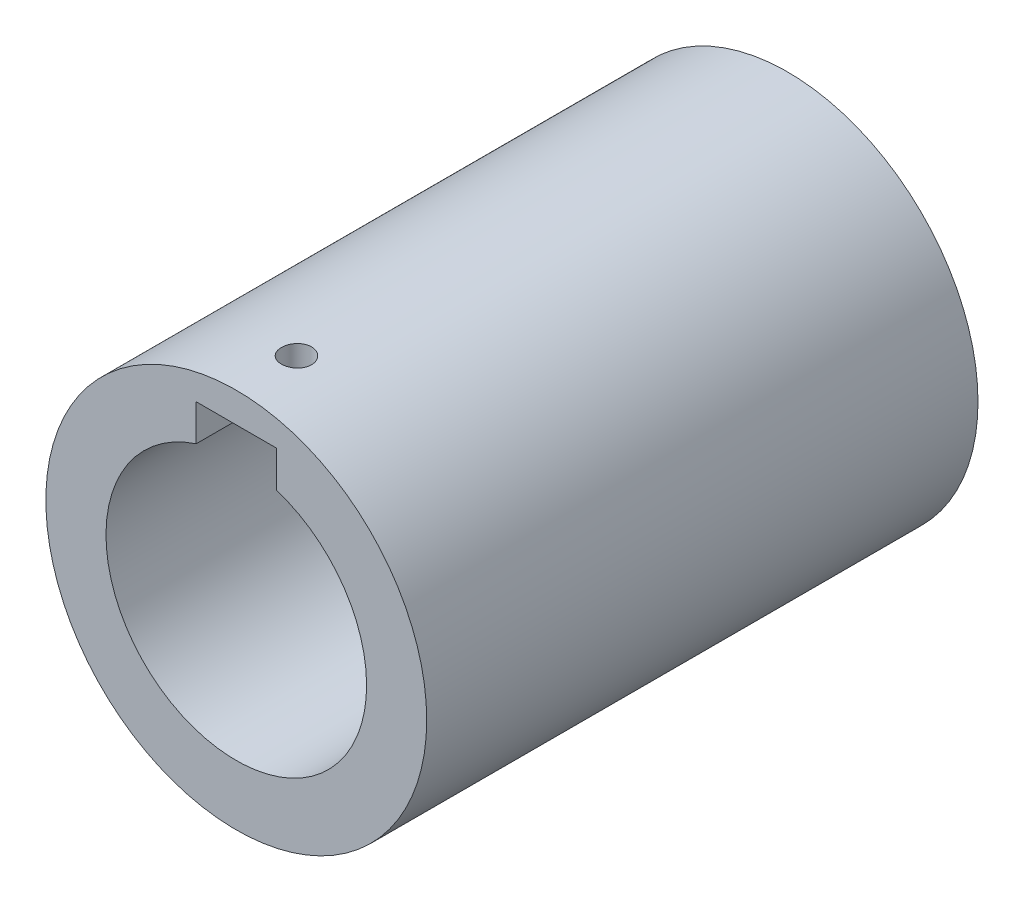
ISO-10303-21;
HEADER;
FILE_DESCRIPTION(('STEP AP214'),'2;1');
FILE_NAME('part.step','',(''),(''),'','','');
FILE_SCHEMA(('AUTOMOTIVE_DESIGN { 1 0 10303 214 1 1 1 1 }'));
ENDSEC;
DATA;
#1=APPLICATION_CONTEXT('core data for automotive mechanical design processes');
#2=APPLICATION_PROTOCOL_DEFINITION('international standard','automotive_design',2000,#1);
#3=PRODUCT_CONTEXT('',#1,'mechanical');
#4=PRODUCT('Part','Part','',(#3));
#5=PRODUCT_RELATED_PRODUCT_CATEGORY('part','',(#4));
#6=PRODUCT_DEFINITION_FORMATION('','',#4);
#7=PRODUCT_DEFINITION_CONTEXT('part definition',#1,'design');
#8=PRODUCT_DEFINITION('design','',#6,#7);
#9=PRODUCT_DEFINITION_SHAPE('','',#8);
#10=(LENGTH_UNIT() NAMED_UNIT(*) SI_UNIT(.MILLI.,.METRE.));
#11=(NAMED_UNIT(*) PLANE_ANGLE_UNIT() SI_UNIT($,.RADIAN.));
#12=(NAMED_UNIT(*) SI_UNIT($,.STERADIAN.) SOLID_ANGLE_UNIT());
#13=UNCERTAINTY_MEASURE_WITH_UNIT(LENGTH_MEASURE(1.E-05),#10,'distance_accuracy_value','');
#14=(GEOMETRIC_REPRESENTATION_CONTEXT(3) GLOBAL_UNCERTAINTY_ASSIGNED_CONTEXT((#13)) GLOBAL_UNIT_ASSIGNED_CONTEXT((#10,
#11,#12)) REPRESENTATION_CONTEXT('',''));
#15=CARTESIAN_POINT('',(0.,0.,0.));
#16=DIRECTION('',(0.,0.,1.));
#17=DIRECTION('',(1.,0.,0.));
#18=AXIS2_PLACEMENT_3D('',#15,#16,#17);
#19=CARTESIAN_POINT('',(0.,0.,55.));
#20=DIRECTION('',(0.,0.,1.));
#21=DIRECTION('',(1.,0.,0.));
#22=AXIS2_PLACEMENT_3D('',#19,#20,#21);
#23=PLANE('',#22);
#24=DIRECTION('',(0.,1.,0.));
#25=VECTOR('',#24,1.);
#26=CARTESIAN_POINT('',(4.,16.,55.));
#27=LINE('',#26,#25);
#28=CARTESIAN_POINT('',(4.,12.369316876853,55.));
#29=VERTEX_POINT('',#28);
#30=CARTESIAN_POINT('',(4.,16.,55.));
#31=VERTEX_POINT('',#30);
#32=EDGE_CURVE('E107',#29,#31,#27,.T.);
#33=ORIENTED_EDGE('',*,*,#32,.F.);
#34=CARTESIAN_POINT('',(0.,0.,55.));
#35=DIRECTION('',(0.,0.,1.));
#36=DIRECTION('',(1.,0.,0.));
#37=AXIS2_PLACEMENT_3D('',#34,#35,#36);
#38=CIRCLE('',#37,13.);
#39=CARTESIAN_POINT('',(-4.,12.369316876853,55.));
#40=VERTEX_POINT('',#39);
#41=EDGE_CURVE('E127',#40,#29,#38,.T.);
#42=ORIENTED_EDGE('',*,*,#41,.F.);
#43=DIRECTION('',(0.,-1.,0.));
#44=VECTOR('',#43,1.);
#45=CARTESIAN_POINT('',(-4.,16.,55.));
#46=LINE('',#45,#44);
#47=CARTESIAN_POINT('',(-4.,16.,55.));
#48=VERTEX_POINT('',#47);
#49=EDGE_CURVE('E104',#48,#40,#46,.T.);
#50=ORIENTED_EDGE('',*,*,#49,.F.);
#51=DIRECTION('',(-1.,0.,0.));
#52=VECTOR('',#51,1.);
#53=CARTESIAN_POINT('',(-4.,16.,55.));
#54=LINE('',#53,#52);
#55=EDGE_CURVE('E96',#31,#48,#54,.T.);
#56=ORIENTED_EDGE('',*,*,#55,.F.);
#57=EDGE_LOOP('',(#33,#42,#50,#56));
#58=FACE_BOUND('',#57,.T.);
#59=CARTESIAN_POINT('',(0.,0.,55.));
#60=DIRECTION('',(0.,0.,1.));
#61=DIRECTION('',(1.,0.,0.));
#62=AXIS2_PLACEMENT_3D('',#59,#60,#61);
#63=CIRCLE('',#62,19.);
#64=CARTESIAN_POINT('',(19.,0.,55.));
#65=VERTEX_POINT('',#64);
#66=EDGE_CURVE('E134',#65,#65,#63,.T.);
#67=ORIENTED_EDGE('',*,*,#66,.T.);
#68=EDGE_LOOP('',(#67));
#69=FACE_BOUND('',#68,.T.);
#70=ADVANCED_FACE('F39',(#58,#69),#23,.T.);
#71=CARTESIAN_POINT('',(0.,0.,0.));
#72=DIRECTION('',(0.,0.,1.));
#73=DIRECTION('',(1.,0.,0.));
#74=AXIS2_PLACEMENT_3D('',#71,#72,#73);
#75=PLANE('',#74);
#76=CARTESIAN_POINT('',(0.,0.,0.));
#77=DIRECTION('',(0.,0.,1.));
#78=DIRECTION('',(1.,0.,0.));
#79=AXIS2_PLACEMENT_3D('',#76,#77,#78);
#80=CIRCLE('',#79,19.);
#81=CARTESIAN_POINT('',(19.,0.,0.));
#82=VERTEX_POINT('',#81);
#83=EDGE_CURVE('E130',#82,#82,#80,.T.);
#84=ORIENTED_EDGE('',*,*,#83,.F.);
#85=EDGE_LOOP('',(#84));
#86=FACE_BOUND('',#85,.T.);
#87=CARTESIAN_POINT('',(0.,0.,0.));
#88=DIRECTION('',(0.,0.,1.));
#89=DIRECTION('',(1.,0.,0.));
#90=AXIS2_PLACEMENT_3D('',#87,#88,#89);
#91=CIRCLE('',#90,13.);
#92=CARTESIAN_POINT('',(13.,0.,0.));
#93=VERTEX_POINT('',#92);
#94=EDGE_CURVE('E125',#93,#93,#91,.T.);
#95=ORIENTED_EDGE('',*,*,#94,.T.);
#96=EDGE_LOOP('',(#95));
#97=FACE_BOUND('',#96,.T.);
#98=ADVANCED_FACE('F175',(#86,#97),#75,.F.);
#99=CARTESIAN_POINT('',(0.,0.,55.));
#100=DIRECTION('',(0.,0.,-1.));
#101=DIRECTION('',(-1.,0.,0.));
#102=AXIS2_PLACEMENT_3D('',#99,#100,#101);
#103=CYLINDRICAL_SURFACE('',#102,19.);
#104=CARTESIAN_POINT('',(0.,19.,47.5));
#105=CARTESIAN_POINT('',(0.084115138718851,18.999999221537,47.5000036806583));
#106=CARTESIAN_POINT('',(0.168287922827546,18.9994354600354,47.5070991504153));
#107=CARTESIAN_POINT('',(0.33430569859837,18.997240706404,47.5353005253483));
#108=CARTESIAN_POINT('',(0.416147925046003,18.9956084974586,47.5564224050853));
#109=CARTESIAN_POINT('',(0.575076027563787,18.9914613431667,47.6120629682147));
#110=CARTESIAN_POINT('',(0.652164524677554,18.9889468894701,47.6465741912389));
#111=CARTESIAN_POINT('',(0.799435680795714,18.9833174206842,47.7280007301823));
#112=CARTESIAN_POINT('',(0.869619836810095,18.9802025362166,47.7749133490418));
#113=CARTESIAN_POINT('',(1.00127051563137,18.9737138537755,47.8799279533634));
#114=CARTESIAN_POINT('',(1.06271896083147,18.9703395405387,47.9380525718033));
#115=CARTESIAN_POINT('',(1.1749989049417,18.9637166459802,48.0637935919702));
#116=CARTESIAN_POINT('',(1.22582994292754,18.960468070122,48.1314104055608));
#117=CARTESIAN_POINT('',(1.31549242293151,18.9544588143707,48.2743246715858));
#118=CARTESIAN_POINT('',(1.3543081273485,18.951698776369,48.3496320268814));
#119=CARTESIAN_POINT('',(1.41873755115466,18.9469848112354,48.5057205754701));
#120=CARTESIAN_POINT('',(1.4443514822562,18.9450308711765,48.5865016809588));
#121=CARTESIAN_POINT('',(1.48159822322927,18.9421545390237,48.7510646600902));
#122=CARTESIAN_POINT('',(1.49326029941244,18.9412299879009,48.8348398713211));
#123=CARTESIAN_POINT('',(1.50236268465663,18.9405102433779,49.003163408575));
#124=CARTESIAN_POINT('',(1.49980323578884,18.9407150307546,49.0877117214142));
#125=CARTESIAN_POINT('',(1.48055943130006,18.9422288673013,49.2549811550176));
#126=CARTESIAN_POINT('',(1.46390684932511,18.9435354324364,49.3377059568554));
#127=CARTESIAN_POINT('',(1.41699882958061,18.9471017023429,49.4991826075616));
#128=CARTESIAN_POINT('',(1.38674327091874,18.9493614155851,49.5779344211145));
#129=CARTESIAN_POINT('',(1.31345245016364,18.9545822190074,49.7293310748596));
#130=CARTESIAN_POINT('',(1.27040289564839,18.9575440928322,49.8019689679994));
#131=CARTESIAN_POINT('',(1.17275641592226,18.9638347400174,49.9389998939552));
#132=CARTESIAN_POINT('',(1.11815928117867,18.9671635200349,50.0033927771302));
#133=CARTESIAN_POINT('',(0.998789069552177,18.9738239428695,50.1222905794803));
#134=CARTESIAN_POINT('',(0.93398851719736,18.9771555685343,50.1767679187932));
#135=CARTESIAN_POINT('',(0.796146882184878,18.9834375709718,50.2740750993956));
#136=CARTESIAN_POINT('',(0.72310579473344,18.9863879475227,50.3169049339094));
#137=CARTESIAN_POINT('',(0.570838809989566,18.991575496542,50.3896994627351));
#138=CARTESIAN_POINT('',(0.491612346167742,18.9938126035852,50.4196629769609));
#139=CARTESIAN_POINT('',(0.329231606345084,18.9973207725944,50.4658552097145));
#140=CARTESIAN_POINT('',(0.246077403532168,18.9985918525535,50.4820841840598));
#141=CARTESIAN_POINT('',(0.0784407393713365,19.0000224384176,50.5003121722034));
#142=CARTESIAN_POINT('',(-0.00603755448042458,19.0001849207592,50.5023492895524));
#143=CARTESIAN_POINT('',(-0.174134501687005,18.9993879456588,50.492235494717));
#144=CARTESIAN_POINT('',(-0.257753162221247,18.9984284975946,50.4800847011234));
#145=CARTESIAN_POINT('',(-0.421648876867881,18.9954975020934,50.4419715748979));
#146=CARTESIAN_POINT('',(-0.501930053359414,18.9935272459175,50.4160268618352));
#147=CARTESIAN_POINT('',(-0.656999501829896,18.9887960412095,50.3510803435539));
#148=CARTESIAN_POINT('',(-0.731787695596674,18.9860350814215,50.3120783524625));
#149=CARTESIAN_POINT('',(-0.873921875208908,18.9800247197833,50.2220283552006));
#150=CARTESIAN_POINT('',(-0.94125179386462,18.976774297697,50.1709550578487));
#151=CARTESIAN_POINT('',(-1.06639608992059,18.9701537726923,50.0582488302556));
#152=CARTESIAN_POINT('',(-1.1242103188841,18.9667836679079,49.9966157353209));
#153=CARTESIAN_POINT('',(-1.22881242487571,18.9602948383227,49.8643743241758));
#154=CARTESIAN_POINT('',(-1.27557547077564,18.9571766897926,49.7937463345234));
#155=CARTESIAN_POINT('',(-1.35657761913601,18.9515527813904,49.6456181472087));
#156=CARTESIAN_POINT('',(-1.39081683559963,18.9490470159439,49.5681180121109));
#157=CARTESIAN_POINT('',(-1.44575693555035,18.94493468603,49.4085340498936));
#158=CARTESIAN_POINT('',(-1.46647311943613,18.9433271056248,49.3264555174995));
#159=CARTESIAN_POINT('',(-1.49382895011884,18.9411896745755,49.1599719251866));
#160=CARTESIAN_POINT('',(-1.50046883646069,18.9406598055914,49.0755669048838));
#161=CARTESIAN_POINT('',(-1.49948094344338,18.9407380213103,48.9070730705285));
#162=CARTESIAN_POINT('',(-1.49189218322356,18.9413429939456,48.8229840234992));
#163=CARTESIAN_POINT('',(-1.46274366938462,18.9436161189885,48.6572785634905));
#164=CARTESIAN_POINT('',(-1.44118389337775,18.9452842730997,48.5756621544735));
#165=CARTESIAN_POINT('',(-1.38471500507716,18.9494949902263,48.4172155015649));
#166=CARTESIAN_POINT('',(-1.34980648222261,18.9520375146316,48.3403850465146));
#167=CARTESIAN_POINT('',(-1.267635548191,18.9577105355609,48.1936691095256));
#168=CARTESIAN_POINT('',(-1.22037336027397,18.9608410214587,48.1237835021084));
#169=CARTESIAN_POINT('',(-1.11469031191135,18.967347409111,47.992741598558));
#170=CARTESIAN_POINT('',(-1.05624065477125,18.9707239299605,47.9316085574228));
#171=CARTESIAN_POINT('',(-0.929892124489476,18.977336317951,47.8199972193479));
#172=CARTESIAN_POINT('',(-0.861990962632755,18.9805721507741,47.7695215105922));
#173=CARTESIAN_POINT('',(-0.718548782250667,18.9865438065605,47.6805972871622));
#174=CARTESIAN_POINT('',(-0.642994879159652,18.989278763737,47.6421695178135));
#175=CARTESIAN_POINT('',(-0.486538032284915,18.9939300983643,47.5785939990502));
#176=CARTESIAN_POINT('',(-0.405641386546966,18.9958474204367,47.5534309168337));
#177=CARTESIAN_POINT('',(-0.270219385273124,18.9981528412889,47.5235385171398));
#178=CARTESIAN_POINT('',(-0.216566049108646,18.9988423900528,47.5147232304149));
#179=CARTESIAN_POINT('',(-0.108616487728126,18.9997662202352,47.5029527902468));
#180=CARTESIAN_POINT('',(-0.0543202640171331,19.0000005027195,47.4999976230875));
#181=CARTESIAN_POINT('',(0.,19.,47.5));
#182=B_SPLINE_CURVE_WITH_KNOTS('',3,(#104,#105,#106,#107,#108,#109,#110,#111,#112,#113,#114,
#115,#116,#117,#118,#119,#120,#121,#122,#123,#124,#125,#126,#127,#128,#129,#130,#131,#132,#133,
#134,#135,#136,#137,#138,#139,#140,#141,#142,#143,#144,#145,#146,#147,#148,#149,#150,#151,#152,
#153,#154,#155,#156,#157,#158,#159,#160,#161,#162,#163,#164,#165,#166,#167,#168,#169,#170,#171,
#172,#173,#174,#175,#176,#177,#178,#179,#180,#181),.UNSPECIFIED.,.T.,.F.,(4,2,2,2,2,2,2,2,2,2,2,
2,2,2,2,2,2,2,2,2,2,2,2,2,2,2,2,2,2,2,2,2,2,2,2,2,2,2,4),(0.,0.252147094273371,
0.504581850393635,0.756876154680074,1.00911563499452,1.26186972745745,1.5146347902352,
1.76772953561851,2.02082022208067,2.27337907304912,2.52593362510898,2.77792029301405,
3.02990920041798,3.28218067450637,3.53445672649366,3.78742409874195,4.04039161814991,
4.29338233453676,4.54636833865407,4.79867484092892,5.05097923429395,5.30296211992514,
5.55494859273475,5.80746776930199,6.05999088458261,6.3130761162029,6.56615904395593,
6.81895512684885,7.07174690772234,7.32384647280326,7.57594644186007,7.82803528025071,
8.08011956311297,8.33286165921683,8.58566506452427,8.8389014107439,9.09184439276203,
9.25467749271784,9.41751021154461),.UNSPECIFIED.);
#183=CARTESIAN_POINT('',(0.,19.,47.5));
#184=VERTEX_POINT('',#183);
#185=EDGE_CURVE('E115',#184,#184,#182,.T.);
#186=ORIENTED_EDGE('',*,*,#185,.T.);
#187=EDGE_LOOP('',(#186));
#188=FACE_BOUND('',#187,.T.);
#189=ORIENTED_EDGE('',*,*,#66,.F.);
#190=EDGE_LOOP('',(#189));
#191=FACE_BOUND('',#190,.T.);
#192=ORIENTED_EDGE('',*,*,#83,.T.);
#193=EDGE_LOOP('',(#192));
#194=FACE_BOUND('',#193,.T.);
#195=ADVANCED_FACE('F170',(#188,#191,#194),#103,.T.);
#196=CARTESIAN_POINT('',(0.,0.,55.));
#197=DIRECTION('',(0.,0.,-1.));
#198=DIRECTION('',(-1.,0.,0.));
#199=AXIS2_PLACEMENT_3D('',#196,#197,#198);
#200=CYLINDRICAL_SURFACE('',#199,13.);
#201=DIRECTION('',(0.,0.,-1.));
#202=VECTOR('',#201,1.);
#203=CARTESIAN_POINT('',(4.,12.369316876853,55.));
#204=LINE('',#203,#202);
#205=CARTESIAN_POINT('',(4.,12.369316876853,35.));
#206=VERTEX_POINT('',#205);
#207=EDGE_CURVE('E110',#206,#29,#204,.F.);
#208=ORIENTED_EDGE('',*,*,#207,.F.);
#209=CARTESIAN_POINT('',(4.,12.369316876853,35.));
#210=CARTESIAN_POINT('',(4.00001385875116,12.3693011035853,34.8903589271203));
#211=CARTESIAN_POINT('',(3.99549233624107,12.3707742931061,34.7807268404003));
#212=CARTESIAN_POINT('',(3.9774863748489,12.3765813332193,34.5623024702961));
#213=CARTESIAN_POINT('',(3.96400404054377,12.3809145121,34.4535099957846));
#214=CARTESIAN_POINT('',(3.92823242982962,12.392309008466,34.2378252008089));
#215=CARTESIAN_POINT('',(3.90596696332449,12.3993629491883,34.1309285529554));
#216=CARTESIAN_POINT('',(3.85284974839525,12.4159702793321,33.9195168222985));
#217=CARTESIAN_POINT('',(3.82199775729043,12.425523739397,33.8150018068974));
#218=CARTESIAN_POINT('',(3.71694633457353,12.4575172220575,33.5061898789446));
#219=CARTESIAN_POINT('',(3.63020445075814,12.4833062806009,33.3063458264658));
#220=CARTESIAN_POINT('',(3.42599546814647,12.540882869718,32.9240331294347));
#221=CARTESIAN_POINT('',(3.30851201676433,12.5726735902852,32.7415738031437));
#222=CARTESIAN_POINT('',(3.0419774942674,12.6398490352741,32.3931078202265));
#223=CARTESIAN_POINT('',(2.89208602235131,12.6753129067266,32.2277579599));
#224=CARTESIAN_POINT('',(2.56677975197935,12.7451667216206,31.9240983633274));
#225=CARTESIAN_POINT('',(2.39135995136348,12.7795564529816,31.7857939389884));
#226=CARTESIAN_POINT('',(2.0152013051214,12.8443041797236,31.5372125821815));
#227=CARTESIAN_POINT('',(1.81398746152874,12.8745559218756,31.4276247928566));
#228=CARTESIAN_POINT('',(1.39497240235985,12.9266567793837,31.2441710108901));
#229=CARTESIAN_POINT('',(1.17718602809775,12.9485133092894,31.1702734821248));
#230=CARTESIAN_POINT('',(0.79860810238211,12.9763910601896,31.0772455220609));
#231=CARTESIAN_POINT('',(0.640373175396689,12.9851977755758,31.048328110208));
#232=CARTESIAN_POINT('',(0.401197402570463,12.9940530862397,31.019360045495));
#233=CARTESIAN_POINT('',(0.321164818330834,12.9962790647686,31.0121053640072));
#234=CARTESIAN_POINT('',(0.160760168893917,12.9992541729958,31.0024235597794));
#235=CARTESIAN_POINT('',(0.080388021189737,13.000002920289,30.9999976870529));
#236=CARTESIAN_POINT('',(0.,13.,31.));
#237=B_SPLINE_CURVE_WITH_KNOTS('',3,(#209,#210,#211,#212,#213,#214,#215,#216,#217,#218,#219,
#220,#221,#222,#223,#224,#225,#226,#227,#228,#229,#230,#231,#232,#233,#234,#235,#236),
.UNSPECIFIED.,.F.,.F.,(4,2,2,2,2,2,2,2,2,2,2,2,2,4),(0.,0.328804854457884,0.65753251159029,
0.985375089077287,1.31322693331081,1.96808749732314,2.62329711673862,3.29813917373688,
3.97311364146039,4.66304825804968,5.35237212393226,5.83439192197556,6.07542224651863,
6.31651495747107),.UNSPECIFIED.);
#238=CARTESIAN_POINT('',(0.,13.,31.));
#239=VERTEX_POINT('',#238);
#240=EDGE_CURVE('E155',#206,#239,#237,.T.);
#241=ORIENTED_EDGE('',*,*,#240,.T.);
#242=CARTESIAN_POINT('',(0.,13.,31.));
#243=CARTESIAN_POINT('',(-0.109765453258314,13.0000130885908,30.9999864329283));
#244=CARTESIAN_POINT('',(-0.21952262551539,12.9986100987204,31.0045179249928));
#245=CARTESIAN_POINT('',(-0.438204350369172,12.9930692479968,31.022565717916));
#246=CARTESIAN_POINT('',(-0.54712906940918,12.9889319491322,31.03608017249));
#247=CARTESIAN_POINT('',(-0.763103561984573,12.9780334192011,31.0719434897533));
#248=CARTESIAN_POINT('',(-0.870157363224069,12.9712788158643,31.0942700404438));
#249=CARTESIAN_POINT('',(-1.08188573698584,12.9553393156279,31.1475389503308));
#250=CARTESIAN_POINT('',(-1.18656025941696,12.9461543676135,31.1784814907392));
#251=CARTESIAN_POINT('',(-1.49587463464697,12.9153049140232,31.2838611291663));
#252=CARTESIAN_POINT('',(-1.69605693294401,12.8903322670203,31.3708924809086));
#253=CARTESIAN_POINT('',(-2.07893425178926,12.8341588201371,31.5757791099767));
#254=CARTESIAN_POINT('',(-2.26162140269826,12.802955236756,31.6936481705329));
#255=CARTESIAN_POINT('',(-2.60985645718219,12.736596939006,31.9605866544617));
#256=CARTESIAN_POINT('',(-2.77481202777811,12.7013585949193,32.1104092399424));
#257=CARTESIAN_POINT('',(-3.07770443102399,12.6313880215514,32.4354133601145));
#258=CARTESIAN_POINT('',(-3.21563397512478,12.5966559311311,32.6106017135156));
#259=CARTESIAN_POINT('',(-3.46378875869761,12.5307260190026,32.9865196187227));
#260=CARTESIAN_POINT('',(-3.57326415507185,12.4996338580647,33.1877639858944));
#261=CARTESIAN_POINT('',(-3.75650184446832,12.4457971920547,33.6068451541065));
#262=CARTESIAN_POINT('',(-3.83029863651979,12.423044628273,33.8246656901149));
#263=CARTESIAN_POINT('',(-3.92305170987474,12.3940024649249,34.2029377269605));
#264=CARTESIAN_POINT('',(-3.95184291467528,12.3848152077971,34.3608220870846));
#265=CARTESIAN_POINT('',(-3.99033927858842,12.3724411445243,34.6791039656526));
#266=CARTESIAN_POINT('',(-4.00004714635314,12.3692534868105,34.8395011241764));
#267=CARTESIAN_POINT('',(-4.,12.369316876853,35.));
#268=B_SPLINE_CURVE_WITH_KNOTS('',3,(#242,#243,#244,#245,#246,#247,#248,#249,#250,#251,#252,
#253,#254,#255,#256,#257,#258,#259,#260,#261,#262,#263,#264,#265,#266,#267),.UNSPECIFIED.,.F.,
.F.,(4,2,2,2,2,2,2,2,2,2,2,2,4),(0.,0.329179737509601,0.658291839018507,0.986575928565797,
1.31486692311727,1.97069200782756,2.62681072255549,3.30055695807385,3.97448464439054,
4.66469436185486,5.3542353472688,5.83528906767895,6.3162745033186),.UNSPECIFIED.);
#269=CARTESIAN_POINT('',(-4.,12.369316876853,35.));
#270=VERTEX_POINT('',#269);
#271=EDGE_CURVE('E11',#239,#270,#268,.T.);
#272=ORIENTED_EDGE('',*,*,#271,.T.);
#273=DIRECTION('',(0.,0.,-1.));
#274=VECTOR('',#273,1.);
#275=CARTESIAN_POINT('',(-4.,12.369316876853,55.));
#276=LINE('',#275,#274);
#277=EDGE_CURVE('E138',#40,#270,#276,.T.);
#278=ORIENTED_EDGE('',*,*,#277,.F.);
#279=ORIENTED_EDGE('',*,*,#41,.T.);
#280=EDGE_LOOP('',(#208,#241,#272,#278,#279));
#281=FACE_BOUND('',#280,.T.);
#282=ORIENTED_EDGE('',*,*,#94,.F.);
#283=EDGE_LOOP('',(#282));
#284=FACE_BOUND('',#283,.T.);
#285=ADVANCED_FACE('F165',(#281,#284),#200,.F.);
#286=CARTESIAN_POINT('',(4.,16.,31.));
#287=DIRECTION('',(1.,0.,0.));
#288=DIRECTION('',(0.,0.,-1.));
#289=AXIS2_PLACEMENT_3D('',#286,#287,#288);
#290=PLANE('',#289);
#291=DIRECTION('',(0.,0.,1.));
#292=VECTOR('',#291,1.);
#293=CARTESIAN_POINT('',(4.,16.,31.));
#294=LINE('',#293,#292);
#295=CARTESIAN_POINT('',(4.,16.,35.));
#296=VERTEX_POINT('',#295);
#297=EDGE_CURVE('E92',#296,#31,#294,.T.);
#298=ORIENTED_EDGE('',*,*,#297,.F.);
#299=DIRECTION('',(0.,1.,0.));
#300=VECTOR('',#299,1.);
#301=CARTESIAN_POINT('',(4.,16.,35.));
#302=LINE('',#301,#300);
#303=EDGE_CURVE('E152',#296,#206,#302,.F.);
#304=ORIENTED_EDGE('',*,*,#303,.T.);
#305=ORIENTED_EDGE('',*,*,#207,.T.);
#306=ORIENTED_EDGE('',*,*,#32,.T.);
#307=EDGE_LOOP('',(#298,#304,#305,#306));
#308=FACE_BOUND('',#307,.T.);
#309=ADVANCED_FACE('F108',(#308),#290,.F.);
#310=CARTESIAN_POINT('',(-4.,16.,31.));
#311=DIRECTION('',(-1.,0.,0.));
#312=DIRECTION('',(0.,-1.,0.));
#313=AXIS2_PLACEMENT_3D('',#310,#311,#312);
#314=PLANE('',#313);
#315=ORIENTED_EDGE('',*,*,#277,.T.);
#316=DIRECTION('',(0.,-1.,0.));
#317=VECTOR('',#316,1.);
#318=CARTESIAN_POINT('',(-4.,16.,35.));
#319=LINE('',#318,#317);
#320=CARTESIAN_POINT('',(-4.,16.,35.));
#321=VERTEX_POINT('',#320);
#322=EDGE_CURVE('E61',#270,#321,#319,.F.);
#323=ORIENTED_EDGE('',*,*,#322,.T.);
#324=DIRECTION('',(0.,0.,1.));
#325=VECTOR('',#324,1.);
#326=CARTESIAN_POINT('',(-4.,16.,31.));
#327=LINE('',#326,#325);
#328=EDGE_CURVE('E103',#321,#48,#327,.T.);
#329=ORIENTED_EDGE('',*,*,#328,.T.);
#330=ORIENTED_EDGE('',*,*,#49,.T.);
#331=EDGE_LOOP('',(#315,#323,#329,#330));
#332=FACE_BOUND('',#331,.T.);
#333=ADVANCED_FACE('F194',(#332),#314,.F.);
#334=CARTESIAN_POINT('',(-4.,16.,31.));
#335=DIRECTION('',(0.,1.,0.));
#336=DIRECTION('',(0.,0.,1.));
#337=AXIS2_PLACEMENT_3D('',#334,#335,#336);
#338=PLANE('',#337);
#339=CARTESIAN_POINT('',(0.,16.,49.));
#340=DIRECTION('',(0.,-1.,0.));
#341=DIRECTION('',(0.,0.,-1.));
#342=AXIS2_PLACEMENT_3D('',#339,#340,#341);
#343=CIRCLE('',#342,1.5);
#344=CARTESIAN_POINT('',(0.,16.,47.5));
#345=VERTEX_POINT('',#344);
#346=EDGE_CURVE('E188',#345,#345,#343,.T.);
#347=ORIENTED_EDGE('',*,*,#346,.F.);
#348=EDGE_LOOP('',(#347));
#349=FACE_BOUND('',#348,.T.);
#350=ORIENTED_EDGE('',*,*,#328,.F.);
#351=CARTESIAN_POINT('',(0.,16.,35.));
#352=DIRECTION('',(0.,1.,0.));
#353=DIRECTION('',(0.,0.,1.));
#354=AXIS2_PLACEMENT_3D('',#351,#352,#353);
#355=CIRCLE('',#354,4.);
#356=CARTESIAN_POINT('',(0.,16.,31.));
#357=VERTEX_POINT('',#356);
#358=EDGE_CURVE('E54',#321,#357,#355,.F.);
#359=ORIENTED_EDGE('',*,*,#358,.T.);
#360=CARTESIAN_POINT('',(0.,16.,35.));
#361=DIRECTION('',(0.,1.,0.));
#362=DIRECTION('',(0.,0.,1.));
#363=AXIS2_PLACEMENT_3D('',#360,#361,#362);
#364=CIRCLE('',#363,4.);
#365=EDGE_CURVE('E99',#357,#296,#364,.F.);
#366=ORIENTED_EDGE('',*,*,#365,.T.);
#367=ORIENTED_EDGE('',*,*,#297,.T.);
#368=ORIENTED_EDGE('',*,*,#55,.T.);
#369=EDGE_LOOP('',(#350,#359,#366,#367,#368));
#370=FACE_BOUND('',#369,.T.);
#371=ADVANCED_FACE('F94',(#349,#370),#338,.F.);
#372=CARTESIAN_POINT('',(0.,0.,35.));
#373=DIRECTION('',(0.,1.,0.));
#374=DIRECTION('',(0.,0.,1.));
#375=AXIS2_PLACEMENT_3D('',#372,#373,#374);
#376=CYLINDRICAL_SURFACE('',#375,4.);
#377=ORIENTED_EDGE('',*,*,#240,.F.);
#378=ORIENTED_EDGE('',*,*,#303,.F.);
#379=ORIENTED_EDGE('',*,*,#365,.F.);
#380=DIRECTION('',(0.,1.,0.));
#381=VECTOR('',#380,1.);
#382=CARTESIAN_POINT('',(0.,0.,31.));
#383=LINE('',#382,#381);
#384=EDGE_CURVE('E146',#239,#357,#383,.T.);
#385=ORIENTED_EDGE('',*,*,#384,.F.);
#386=EDGE_LOOP('',(#377,#378,#379,#385));
#387=FACE_BOUND('',#386,.T.);
#388=ADVANCED_FACE('F162',(#387),#376,.F.);
#389=CARTESIAN_POINT('',(0.,0.,35.));
#390=DIRECTION('',(0.,-1.,0.));
#391=DIRECTION('',(1.,0.,0.));
#392=AXIS2_PLACEMENT_3D('',#389,#390,#391);
#393=CYLINDRICAL_SURFACE('',#392,4.);
#394=ORIENTED_EDGE('',*,*,#358,.F.);
#395=ORIENTED_EDGE('',*,*,#322,.F.);
#396=ORIENTED_EDGE('',*,*,#271,.F.);
#397=ORIENTED_EDGE('',*,*,#384,.T.);
#398=EDGE_LOOP('',(#394,#395,#396,#397));
#399=FACE_BOUND('',#398,.T.);
#400=ADVANCED_FACE('F41',(#399),#393,.F.);
#401=CARTESIAN_POINT('',(0.,19.,49.));
#402=DIRECTION('',(0.,-1.,0.));
#403=DIRECTION('',(0.,0.,-1.));
#404=AXIS2_PLACEMENT_3D('',#401,#402,#403);
#405=CYLINDRICAL_SURFACE('',#404,1.5);
#406=ORIENTED_EDGE('',*,*,#346,.T.);
#407=EDGE_LOOP('',(#406));
#408=FACE_BOUND('',#407,.T.);
#409=ORIENTED_EDGE('',*,*,#185,.F.);
#410=EDGE_LOOP('',(#409));
#411=FACE_BOUND('',#410,.T.);
#412=ADVANCED_FACE('F189',(#408,#411),#405,.F.);
#413=CLOSED_SHELL('',(#70,#98,#195,#285,#309,#333,#371,#388,#400,#412));
#414=MANIFOLD_SOLID_BREP('B2',#413);
#415=ADVANCED_BREP_SHAPE_REPRESENTATION('',(#18,#414),#14);
#416=SHAPE_DEFINITION_REPRESENTATION(#9,#415);
ENDSEC;
END-ISO-10303-21;
